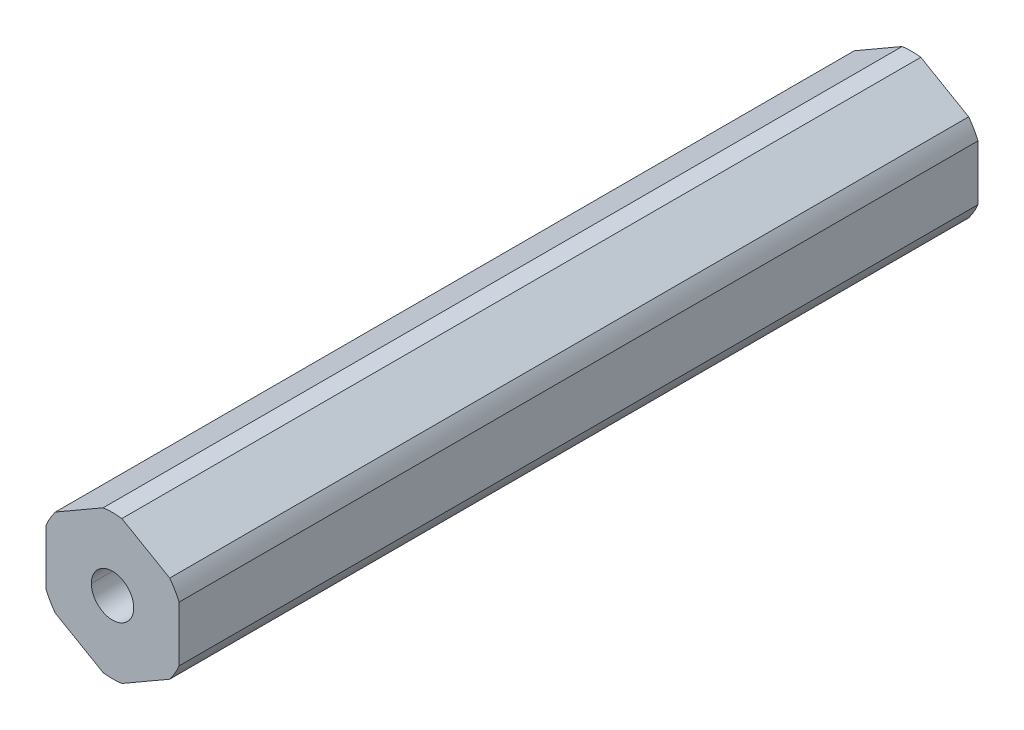
ISO-10303-21;
HEADER;
FILE_DESCRIPTION(('STEP AP214'),'2;1');
FILE_NAME('part.step','',(''),(''),'','','');
FILE_SCHEMA(('AUTOMOTIVE_DESIGN { 1 0 10303 214 1 1 1 1 }'));
ENDSEC;
DATA;
#1=APPLICATION_CONTEXT('core data for automotive mechanical design processes');
#2=APPLICATION_PROTOCOL_DEFINITION('international standard','automotive_design',2000,#1);
#3=PRODUCT_CONTEXT('',#1,'mechanical');
#4=PRODUCT('Part','Part','',(#3));
#5=PRODUCT_RELATED_PRODUCT_CATEGORY('part','',(#4));
#6=PRODUCT_DEFINITION_FORMATION('','',#4);
#7=PRODUCT_DEFINITION_CONTEXT('part definition',#1,'design');
#8=PRODUCT_DEFINITION('design','',#6,#7);
#9=PRODUCT_DEFINITION_SHAPE('','',#8);
#10=(LENGTH_UNIT() NAMED_UNIT(*) SI_UNIT(.MILLI.,.METRE.));
#11=(NAMED_UNIT(*) PLANE_ANGLE_UNIT() SI_UNIT($,.RADIAN.));
#12=(NAMED_UNIT(*) SI_UNIT($,.STERADIAN.) SOLID_ANGLE_UNIT());
#13=UNCERTAINTY_MEASURE_WITH_UNIT(LENGTH_MEASURE(1.E-05),#10,'distance_accuracy_value','');
#14=(GEOMETRIC_REPRESENTATION_CONTEXT(3) GLOBAL_UNCERTAINTY_ASSIGNED_CONTEXT((#13)) GLOBAL_UNIT_ASSIGNED_CONTEXT((#10,
#11,#12)) REPRESENTATION_CONTEXT('',''));
#15=CARTESIAN_POINT('',(0.,0.,0.));
#16=DIRECTION('',(0.,0.,1.));
#17=DIRECTION('',(1.,0.,0.));
#18=AXIS2_PLACEMENT_3D('',#15,#16,#17);
#19=CARTESIAN_POINT('',(0.,0.,-38.1));
#20=DIRECTION('',(0.,0.,1.));
#21=DIRECTION('',(1.,0.,0.));
#22=AXIS2_PLACEMENT_3D('',#19,#20,#21);
#23=PLANE('',#22);
#24=CARTESIAN_POINT('',(0.,0.,-38.1));
#25=DIRECTION('',(0.,0.,1.));
#26=DIRECTION('',(1.,0.,0.));
#27=AXIS2_PLACEMENT_3D('',#24,#25,#26);
#28=CIRCLE('',#27,2.0193);
#29=CARTESIAN_POINT('',(-2.0193,0.,-38.1));
#30=VERTEX_POINT('',#29);
#31=CARTESIAN_POINT('',(2.0193,0.,-38.1));
#32=VERTEX_POINT('',#31);
#33=EDGE_CURVE('E284',#30,#32,#28,.T.);
#34=ORIENTED_EDGE('',*,*,#33,.T.);
#35=CARTESIAN_POINT('',(0.,0.,-38.1));
#36=DIRECTION('',(0.,0.,1.));
#37=DIRECTION('',(1.,0.,0.));
#38=AXIS2_PLACEMENT_3D('',#35,#36,#37);
#39=CIRCLE('',#38,2.0193);
#40=EDGE_CURVE('E263',#32,#30,#39,.T.);
#41=ORIENTED_EDGE('',*,*,#40,.T.);
#42=EDGE_LOOP('',(#34,#41));
#43=FACE_BOUND('',#42,.T.);
#44=DIRECTION('',(0.,1.,0.));
#45=VECTOR('',#44,1.);
#46=CARTESIAN_POINT('',(6.345,0.,-38.1));
#47=LINE('',#46,#45);
#48=CARTESIAN_POINT('',(6.345,-2.63398462410091,-38.1));
#49=VERTEX_POINT('',#48);
#50=CARTESIAN_POINT('',(6.345,2.63398462410091,-38.1));
#51=VERTEX_POINT('',#50);
#52=EDGE_CURVE('E243',#49,#51,#47,.T.);
#53=ORIENTED_EDGE('',*,*,#52,.F.);
#54=CARTESIAN_POINT('',(0.,0.,-38.1));
#55=DIRECTION('',(0.,0.,1.));
#56=DIRECTION('',(1.,0.,0.));
#57=AXIS2_PLACEMENT_3D('',#54,#55,#56);
#58=CIRCLE('',#57,6.87);
#59=CARTESIAN_POINT('',(5.45359759764899,-4.17793887496182,-38.1));
#60=VERTEX_POINT('',#59);
#61=EDGE_CURVE('E25',#60,#49,#58,.T.);
#62=ORIENTED_EDGE('',*,*,#61,.F.);
#63=DIRECTION('',(0.866025403784439,0.5,0.));
#64=VECTOR('',#63,1.);
#65=CARTESIAN_POINT('',(3.1725,-5.49493118701227,-38.1));
#66=LINE('',#65,#64);
#67=CARTESIAN_POINT('',(0.891402402351011,-6.81192349906272,-38.1));
#68=VERTEX_POINT('',#67);
#69=EDGE_CURVE('E80',#68,#60,#66,.T.);
#70=ORIENTED_EDGE('',*,*,#69,.F.);
#71=CARTESIAN_POINT('',(0.,0.,-38.1));
#72=DIRECTION('',(0.,0.,1.));
#73=DIRECTION('',(1.,0.,0.));
#74=AXIS2_PLACEMENT_3D('',#71,#72,#73);
#75=CIRCLE('',#74,6.87);
#76=CARTESIAN_POINT('',(-0.891402402351014,-6.81192349906272,-38.1));
#77=VERTEX_POINT('',#76);
#78=EDGE_CURVE('E232',#77,#68,#75,.T.);
#79=ORIENTED_EDGE('',*,*,#78,.F.);
#80=DIRECTION('',(0.866025403784439,-0.5,0.));
#81=VECTOR('',#80,1.);
#82=CARTESIAN_POINT('',(-3.1725,-5.49493118701226,-38.1));
#83=LINE('',#82,#81);
#84=CARTESIAN_POINT('',(-5.45359759764899,-4.17793887496181,-38.1));
#85=VERTEX_POINT('',#84);
#86=EDGE_CURVE('E219',#85,#77,#83,.T.);
#87=ORIENTED_EDGE('',*,*,#86,.F.);
#88=CARTESIAN_POINT('',(0.,0.,-38.1));
#89=DIRECTION('',(0.,0.,1.));
#90=DIRECTION('',(1.,0.,0.));
#91=AXIS2_PLACEMENT_3D('',#88,#89,#90);
#92=CIRCLE('',#91,6.87);
#93=CARTESIAN_POINT('',(-6.345,-2.63398462410091,-38.1));
#94=VERTEX_POINT('',#93);
#95=EDGE_CURVE('E149',#94,#85,#92,.T.);
#96=ORIENTED_EDGE('',*,*,#95,.F.);
#97=DIRECTION('',(0.,-1.,0.));
#98=VECTOR('',#97,1.);
#99=CARTESIAN_POINT('',(-6.345,0.,-38.1));
#100=LINE('',#99,#98);
#101=CARTESIAN_POINT('',(-6.345,2.63398462410091,-38.1));
#102=VERTEX_POINT('',#101);
#103=EDGE_CURVE('E228',#102,#94,#100,.T.);
#104=ORIENTED_EDGE('',*,*,#103,.F.);
#105=CARTESIAN_POINT('',(0.,0.,-38.1));
#106=DIRECTION('',(0.,0.,1.));
#107=DIRECTION('',(1.,0.,0.));
#108=AXIS2_PLACEMENT_3D('',#105,#106,#107);
#109=CIRCLE('',#108,6.87);
#110=CARTESIAN_POINT('',(-5.45359759764899,4.17793887496182,-38.1));
#111=VERTEX_POINT('',#110);
#112=EDGE_CURVE('E182',#111,#102,#109,.T.);
#113=ORIENTED_EDGE('',*,*,#112,.F.);
#114=DIRECTION('',(-0.866025403784439,-0.5,0.));
#115=VECTOR('',#114,1.);
#116=CARTESIAN_POINT('',(-3.1725,5.49493118701227,-38.1));
#117=LINE('',#116,#115);
#118=CARTESIAN_POINT('',(-0.891402402351017,6.81192349906272,-38.1));
#119=VERTEX_POINT('',#118);
#120=EDGE_CURVE('E195',#119,#111,#117,.T.);
#121=ORIENTED_EDGE('',*,*,#120,.F.);
#122=CARTESIAN_POINT('',(0.,0.,-38.1));
#123=DIRECTION('',(0.,0.,1.));
#124=DIRECTION('',(1.,0.,0.));
#125=AXIS2_PLACEMENT_3D('',#122,#123,#124);
#126=CIRCLE('',#125,6.87);
#127=CARTESIAN_POINT('',(0.891402402351017,6.81192349906272,-38.1));
#128=VERTEX_POINT('',#127);
#129=EDGE_CURVE('E198',#128,#119,#126,.T.);
#130=ORIENTED_EDGE('',*,*,#129,.F.);
#131=DIRECTION('',(-0.866025403784439,0.5,0.));
#132=VECTOR('',#131,1.);
#133=CARTESIAN_POINT('',(3.1725,5.49493118701227,-38.1));
#134=LINE('',#133,#132);
#135=CARTESIAN_POINT('',(5.45359759764899,4.17793887496182,-38.1));
#136=VERTEX_POINT('',#135);
#137=EDGE_CURVE('E290',#136,#128,#134,.T.);
#138=ORIENTED_EDGE('',*,*,#137,.F.);
#139=CARTESIAN_POINT('',(0.,0.,-38.1));
#140=DIRECTION('',(0.,0.,1.));
#141=DIRECTION('',(1.,0.,0.));
#142=AXIS2_PLACEMENT_3D('',#139,#140,#141);
#143=CIRCLE('',#142,6.87);
#144=EDGE_CURVE('E253',#51,#136,#143,.T.);
#145=ORIENTED_EDGE('',*,*,#144,.F.);
#146=EDGE_LOOP('',(#53,#62,#70,#79,#87,#96,#104,#113,#121,#130,#138,#145));
#147=FACE_BOUND('',#146,.T.);
#148=ADVANCED_FACE('F15',(#43,#147),#23,.F.);
#149=CARTESIAN_POINT('',(0.,0.,38.1));
#150=DIRECTION('',(0.,0.,1.));
#151=DIRECTION('',(1.,0.,0.));
#152=AXIS2_PLACEMENT_3D('',#149,#150,#151);
#153=PLANE('',#152);
#154=CARTESIAN_POINT('',(0.,0.,38.1));
#155=DIRECTION('',(0.,0.,1.));
#156=DIRECTION('',(1.,0.,0.));
#157=AXIS2_PLACEMENT_3D('',#154,#155,#156);
#158=CIRCLE('',#157,2.0193);
#159=CARTESIAN_POINT('',(-2.0193,0.,38.1));
#160=VERTEX_POINT('',#159);
#161=CARTESIAN_POINT('',(2.0193,0.,38.1));
#162=VERTEX_POINT('',#161);
#163=EDGE_CURVE('E238',#160,#162,#158,.T.);
#164=ORIENTED_EDGE('',*,*,#163,.F.);
#165=CARTESIAN_POINT('',(0.,0.,38.1));
#166=DIRECTION('',(0.,0.,1.));
#167=DIRECTION('',(1.,0.,0.));
#168=AXIS2_PLACEMENT_3D('',#165,#166,#167);
#169=CIRCLE('',#168,2.0193);
#170=EDGE_CURVE('E266',#162,#160,#169,.T.);
#171=ORIENTED_EDGE('',*,*,#170,.F.);
#172=EDGE_LOOP('',(#164,#171));
#173=FACE_BOUND('',#172,.T.);
#174=DIRECTION('',(0.,1.,0.));
#175=VECTOR('',#174,1.);
#176=CARTESIAN_POINT('',(6.345,0.,38.1));
#177=LINE('',#176,#175);
#178=CARTESIAN_POINT('',(6.345,-2.63398462410091,38.1));
#179=VERTEX_POINT('',#178);
#180=CARTESIAN_POINT('',(6.345,2.63398462410091,38.1));
#181=VERTEX_POINT('',#180);
#182=EDGE_CURVE('E304',#179,#181,#177,.T.);
#183=ORIENTED_EDGE('',*,*,#182,.T.);
#184=CARTESIAN_POINT('',(0.,0.,38.1));
#185=DIRECTION('',(0.,0.,1.));
#186=DIRECTION('',(1.,0.,0.));
#187=AXIS2_PLACEMENT_3D('',#184,#185,#186);
#188=CIRCLE('',#187,6.87);
#189=CARTESIAN_POINT('',(5.45359759764899,4.17793887496182,38.1));
#190=VERTEX_POINT('',#189);
#191=EDGE_CURVE('E252',#181,#190,#188,.T.);
#192=ORIENTED_EDGE('',*,*,#191,.T.);
#193=DIRECTION('',(-0.866025403784439,0.5,0.));
#194=VECTOR('',#193,1.);
#195=CARTESIAN_POINT('',(3.1725,5.49493118701227,38.1));
#196=LINE('',#195,#194);
#197=CARTESIAN_POINT('',(0.891402402351017,6.81192349906272,38.1));
#198=VERTEX_POINT('',#197);
#199=EDGE_CURVE('E190',#190,#198,#196,.T.);
#200=ORIENTED_EDGE('',*,*,#199,.T.);
#201=CARTESIAN_POINT('',(0.,0.,38.1));
#202=DIRECTION('',(0.,0.,1.));
#203=DIRECTION('',(1.,0.,0.));
#204=AXIS2_PLACEMENT_3D('',#201,#202,#203);
#205=CIRCLE('',#204,6.87);
#206=CARTESIAN_POINT('',(-0.891402402351017,6.81192349906272,38.1));
#207=VERTEX_POINT('',#206);
#208=EDGE_CURVE('E186',#198,#207,#205,.T.);
#209=ORIENTED_EDGE('',*,*,#208,.T.);
#210=DIRECTION('',(-0.866025403784439,-0.5,0.));
#211=VECTOR('',#210,1.);
#212=CARTESIAN_POINT('',(-3.1725,5.49493118701227,38.1));
#213=LINE('',#212,#211);
#214=CARTESIAN_POINT('',(-5.45359759764899,4.17793887496182,38.1));
#215=VERTEX_POINT('',#214);
#216=EDGE_CURVE('E172',#207,#215,#213,.T.);
#217=ORIENTED_EDGE('',*,*,#216,.T.);
#218=CARTESIAN_POINT('',(0.,0.,38.1));
#219=DIRECTION('',(0.,0.,1.));
#220=DIRECTION('',(1.,0.,0.));
#221=AXIS2_PLACEMENT_3D('',#218,#219,#220);
#222=CIRCLE('',#221,6.87);
#223=CARTESIAN_POINT('',(-6.345,2.63398462410091,38.1));
#224=VERTEX_POINT('',#223);
#225=EDGE_CURVE('E224',#215,#224,#222,.T.);
#226=ORIENTED_EDGE('',*,*,#225,.T.);
#227=DIRECTION('',(0.,-1.,0.));
#228=VECTOR('',#227,1.);
#229=CARTESIAN_POINT('',(-6.345,0.,38.1));
#230=LINE('',#229,#228);
#231=CARTESIAN_POINT('',(-6.345,-2.63398462410091,38.1));
#232=VERTEX_POINT('',#231);
#233=EDGE_CURVE('E139',#224,#232,#230,.T.);
#234=ORIENTED_EDGE('',*,*,#233,.T.);
#235=CARTESIAN_POINT('',(0.,0.,38.1));
#236=DIRECTION('',(0.,0.,1.));
#237=DIRECTION('',(1.,0.,0.));
#238=AXIS2_PLACEMENT_3D('',#235,#236,#237);
#239=CIRCLE('',#238,6.87);
#240=CARTESIAN_POINT('',(-5.45359759764899,-4.17793887496181,38.1));
#241=VERTEX_POINT('',#240);
#242=EDGE_CURVE('E215',#232,#241,#239,.T.);
#243=ORIENTED_EDGE('',*,*,#242,.T.);
#244=DIRECTION('',(0.866025403784439,-0.5,0.));
#245=VECTOR('',#244,1.);
#246=CARTESIAN_POINT('',(-3.1725,-5.49493118701226,38.1));
#247=LINE('',#246,#245);
#248=CARTESIAN_POINT('',(-0.891402402351014,-6.81192349906272,38.1));
#249=VERTEX_POINT('',#248);
#250=EDGE_CURVE('E237',#241,#249,#247,.T.);
#251=ORIENTED_EDGE('',*,*,#250,.T.);
#252=CARTESIAN_POINT('',(0.,0.,38.1));
#253=DIRECTION('',(0.,0.,1.));
#254=DIRECTION('',(1.,0.,0.));
#255=AXIS2_PLACEMENT_3D('',#252,#253,#254);
#256=CIRCLE('',#255,6.87);
#257=CARTESIAN_POINT('',(0.891402402351011,-6.81192349906272,38.1));
#258=VERTEX_POINT('',#257);
#259=EDGE_CURVE('E94',#249,#258,#256,.T.);
#260=ORIENTED_EDGE('',*,*,#259,.T.);
#261=DIRECTION('',(0.866025403784439,0.5,0.));
#262=VECTOR('',#261,1.);
#263=CARTESIAN_POINT('',(3.1725,-5.49493118701227,38.1));
#264=LINE('',#263,#262);
#265=CARTESIAN_POINT('',(5.45359759764899,-4.17793887496182,38.1));
#266=VERTEX_POINT('',#265);
#267=EDGE_CURVE('E274',#258,#266,#264,.T.);
#268=ORIENTED_EDGE('',*,*,#267,.T.);
#269=CARTESIAN_POINT('',(0.,0.,38.1));
#270=DIRECTION('',(0.,0.,1.));
#271=DIRECTION('',(1.,0.,0.));
#272=AXIS2_PLACEMENT_3D('',#269,#270,#271);
#273=CIRCLE('',#272,6.87);
#274=EDGE_CURVE('E10',#266,#179,#273,.T.);
#275=ORIENTED_EDGE('',*,*,#274,.T.);
#276=EDGE_LOOP('',(#183,#192,#200,#209,#217,#226,#234,#243,#251,#260,#268,#275));
#277=FACE_BOUND('',#276,.T.);
#278=ADVANCED_FACE('F188',(#173,#277),#153,.T.);
#279=CARTESIAN_POINT('',(0.,0.,38.1));
#280=DIRECTION('',(0.,0.,-1.));
#281=DIRECTION('',(-1.,0.,0.));
#282=AXIS2_PLACEMENT_3D('',#279,#280,#281);
#283=CYLINDRICAL_SURFACE('',#282,6.87);
#284=ORIENTED_EDGE('',*,*,#61,.T.);
#285=DIRECTION('',(0.,0.,-1.));
#286=VECTOR('',#285,1.);
#287=CARTESIAN_POINT('',(6.345,-2.63398462410091,38.1));
#288=LINE('',#287,#286);
#289=EDGE_CURVE('E283',#179,#49,#288,.T.);
#290=ORIENTED_EDGE('',*,*,#289,.F.);
#291=ORIENTED_EDGE('',*,*,#274,.F.);
#292=DIRECTION('',(0.,0.,-1.));
#293=VECTOR('',#292,1.);
#294=CARTESIAN_POINT('',(5.45359759764899,-4.17793887496182,38.1));
#295=LINE('',#294,#293);
#296=EDGE_CURVE('E259',#266,#60,#295,.T.);
#297=ORIENTED_EDGE('',*,*,#296,.T.);
#298=EDGE_LOOP('',(#284,#290,#291,#297));
#299=FACE_BOUND('',#298,.T.);
#300=ADVANCED_FACE('F329',(#299),#283,.T.);
#301=CARTESIAN_POINT('',(0.,0.,38.1));
#302=DIRECTION('',(0.,0.,-1.));
#303=DIRECTION('',(-1.,0.,0.));
#304=AXIS2_PLACEMENT_3D('',#301,#302,#303);
#305=CYLINDRICAL_SURFACE('',#304,2.0193);
#306=DIRECTION('',(0.,0.,-1.));
#307=VECTOR('',#306,1.);
#308=CARTESIAN_POINT('',(2.0193,0.,38.1));
#309=LINE('',#308,#307);
#310=EDGE_CURVE('E242',#162,#32,#309,.T.);
#311=ORIENTED_EDGE('',*,*,#310,.F.);
#312=ORIENTED_EDGE('',*,*,#170,.T.);
#313=DIRECTION('',(0.,0.,-1.));
#314=VECTOR('',#313,1.);
#315=CARTESIAN_POINT('',(-2.0193,0.,38.1));
#316=LINE('',#315,#314);
#317=EDGE_CURVE('E248',#160,#30,#316,.T.);
#318=ORIENTED_EDGE('',*,*,#317,.T.);
#319=ORIENTED_EDGE('',*,*,#40,.F.);
#320=EDGE_LOOP('',(#311,#312,#318,#319));
#321=FACE_BOUND('',#320,.T.);
#322=ADVANCED_FACE('F316',(#321),#305,.F.);
#323=CARTESIAN_POINT('',(3.1725,-5.49493118701227,38.1));
#324=DIRECTION('',(-0.5,0.866025403784439,0.));
#325=DIRECTION('',(0.,0.,1.));
#326=AXIS2_PLACEMENT_3D('',#323,#324,#325);
#327=PLANE('',#326);
#328=ORIENTED_EDGE('',*,*,#69,.T.);
#329=ORIENTED_EDGE('',*,*,#296,.F.);
#330=ORIENTED_EDGE('',*,*,#267,.F.);
#331=DIRECTION('',(0.,0.,-1.));
#332=VECTOR('',#331,1.);
#333=CARTESIAN_POINT('',(0.891402402351011,-6.81192349906272,38.1));
#334=LINE('',#333,#332);
#335=EDGE_CURVE('E236',#258,#68,#334,.T.);
#336=ORIENTED_EDGE('',*,*,#335,.T.);
#337=EDGE_LOOP('',(#328,#329,#330,#336));
#338=FACE_BOUND('',#337,.T.);
#339=ADVANCED_FACE('F332',(#338),#327,.F.);
#340=CARTESIAN_POINT('',(0.,0.,38.1));
#341=DIRECTION('',(0.,0.,-1.));
#342=DIRECTION('',(-1.,0.,0.));
#343=AXIS2_PLACEMENT_3D('',#340,#341,#342);
#344=CYLINDRICAL_SURFACE('',#343,6.87);
#345=ORIENTED_EDGE('',*,*,#78,.T.);
#346=ORIENTED_EDGE('',*,*,#335,.F.);
#347=ORIENTED_EDGE('',*,*,#259,.F.);
#348=DIRECTION('',(0.,0.,-1.));
#349=VECTOR('',#348,1.);
#350=CARTESIAN_POINT('',(-0.891402402351014,-6.81192349906272,38.1));
#351=LINE('',#350,#349);
#352=EDGE_CURVE('E296',#249,#77,#351,.T.);
#353=ORIENTED_EDGE('',*,*,#352,.T.);
#354=EDGE_LOOP('',(#345,#346,#347,#353));
#355=FACE_BOUND('',#354,.T.);
#356=ADVANCED_FACE('F333',(#355),#344,.T.);
#357=CARTESIAN_POINT('',(-3.1725,-5.49493118701226,38.1));
#358=DIRECTION('',(0.5,0.866025403784439,0.));
#359=DIRECTION('',(0.,0.,-1.));
#360=AXIS2_PLACEMENT_3D('',#357,#358,#359);
#361=PLANE('',#360);
#362=ORIENTED_EDGE('',*,*,#86,.T.);
#363=ORIENTED_EDGE('',*,*,#352,.F.);
#364=ORIENTED_EDGE('',*,*,#250,.F.);
#365=DIRECTION('',(0.,0.,-1.));
#366=VECTOR('',#365,1.);
#367=CARTESIAN_POINT('',(-5.45359759764899,-4.17793887496181,38.1));
#368=LINE('',#367,#366);
#369=EDGE_CURVE('E220',#241,#85,#368,.T.);
#370=ORIENTED_EDGE('',*,*,#369,.T.);
#371=EDGE_LOOP('',(#362,#363,#364,#370));
#372=FACE_BOUND('',#371,.T.);
#373=ADVANCED_FACE('F338',(#372),#361,.F.);
#374=CARTESIAN_POINT('',(0.,0.,38.1));
#375=DIRECTION('',(0.,0.,-1.));
#376=DIRECTION('',(-1.,0.,0.));
#377=AXIS2_PLACEMENT_3D('',#374,#375,#376);
#378=CYLINDRICAL_SURFACE('',#377,6.87);
#379=ORIENTED_EDGE('',*,*,#95,.T.);
#380=ORIENTED_EDGE('',*,*,#369,.F.);
#381=ORIENTED_EDGE('',*,*,#242,.F.);
#382=DIRECTION('',(0.,0.,-1.));
#383=VECTOR('',#382,1.);
#384=CARTESIAN_POINT('',(-6.345,-2.63398462410091,38.1));
#385=LINE('',#384,#383);
#386=EDGE_CURVE('E227',#232,#94,#385,.T.);
#387=ORIENTED_EDGE('',*,*,#386,.T.);
#388=EDGE_LOOP('',(#379,#380,#381,#387));
#389=FACE_BOUND('',#388,.T.);
#390=ADVANCED_FACE('F340',(#389),#378,.T.);
#391=CARTESIAN_POINT('',(-6.345,0.,38.1));
#392=DIRECTION('',(1.,0.,0.));
#393=DIRECTION('',(0.,1.,0.));
#394=AXIS2_PLACEMENT_3D('',#391,#392,#393);
#395=PLANE('',#394);
#396=ORIENTED_EDGE('',*,*,#103,.T.);
#397=ORIENTED_EDGE('',*,*,#386,.F.);
#398=ORIENTED_EDGE('',*,*,#233,.F.);
#399=DIRECTION('',(0.,0.,-1.));
#400=VECTOR('',#399,1.);
#401=CARTESIAN_POINT('',(-6.345,2.63398462410091,38.1));
#402=LINE('',#401,#400);
#403=EDGE_CURVE('E221',#224,#102,#402,.T.);
#404=ORIENTED_EDGE('',*,*,#403,.T.);
#405=EDGE_LOOP('',(#396,#397,#398,#404));
#406=FACE_BOUND('',#405,.T.);
#407=ADVANCED_FACE('F469',(#406),#395,.F.);
#408=CARTESIAN_POINT('',(0.,0.,38.1));
#409=DIRECTION('',(0.,0.,-1.));
#410=DIRECTION('',(-1.,0.,0.));
#411=AXIS2_PLACEMENT_3D('',#408,#409,#410);
#412=CYLINDRICAL_SURFACE('',#411,6.87);
#413=ORIENTED_EDGE('',*,*,#112,.T.);
#414=ORIENTED_EDGE('',*,*,#403,.F.);
#415=ORIENTED_EDGE('',*,*,#225,.F.);
#416=DIRECTION('',(0.,0.,-1.));
#417=VECTOR('',#416,1.);
#418=CARTESIAN_POINT('',(-5.45359759764899,4.17793887496182,38.1));
#419=LINE('',#418,#417);
#420=EDGE_CURVE('E179',#215,#111,#419,.T.);
#421=ORIENTED_EDGE('',*,*,#420,.T.);
#422=EDGE_LOOP('',(#413,#414,#415,#421));
#423=FACE_BOUND('',#422,.T.);
#424=ADVANCED_FACE('F465',(#423),#412,.T.);
#425=CARTESIAN_POINT('',(-3.1725,5.49493118701227,38.1));
#426=DIRECTION('',(0.5,-0.866025403784439,0.));
#427=DIRECTION('',(0.,0.,-1.));
#428=AXIS2_PLACEMENT_3D('',#425,#426,#427);
#429=PLANE('',#428);
#430=ORIENTED_EDGE('',*,*,#120,.T.);
#431=ORIENTED_EDGE('',*,*,#420,.F.);
#432=ORIENTED_EDGE('',*,*,#216,.F.);
#433=DIRECTION('',(0.,0.,-1.));
#434=VECTOR('',#433,1.);
#435=CARTESIAN_POINT('',(-0.891402402351017,6.81192349906272,38.1));
#436=LINE('',#435,#434);
#437=EDGE_CURVE('E18',#207,#119,#436,.T.);
#438=ORIENTED_EDGE('',*,*,#437,.T.);
#439=EDGE_LOOP('',(#430,#431,#432,#438));
#440=FACE_BOUND('',#439,.T.);
#441=ADVANCED_FACE('F175',(#440),#429,.F.);
#442=CARTESIAN_POINT('',(0.,0.,38.1));
#443=DIRECTION('',(0.,0.,-1.));
#444=DIRECTION('',(-1.,0.,0.));
#445=AXIS2_PLACEMENT_3D('',#442,#443,#444);
#446=CYLINDRICAL_SURFACE('',#445,6.87);
#447=ORIENTED_EDGE('',*,*,#129,.T.);
#448=ORIENTED_EDGE('',*,*,#437,.F.);
#449=ORIENTED_EDGE('',*,*,#208,.F.);
#450=DIRECTION('',(0.,0.,-1.));
#451=VECTOR('',#450,1.);
#452=CARTESIAN_POINT('',(0.891402402351017,6.81192349906272,38.1));
#453=LINE('',#452,#451);
#454=EDGE_CURVE('E210',#198,#128,#453,.T.);
#455=ORIENTED_EDGE('',*,*,#454,.T.);
#456=EDGE_LOOP('',(#447,#448,#449,#455));
#457=FACE_BOUND('',#456,.T.);
#458=ADVANCED_FACE('F197',(#457),#446,.T.);
#459=CARTESIAN_POINT('',(3.1725,5.49493118701227,38.1));
#460=DIRECTION('',(-0.5,-0.866025403784439,0.));
#461=DIRECTION('',(-0.866025403784439,0.5,0.));
#462=AXIS2_PLACEMENT_3D('',#459,#460,#461);
#463=PLANE('',#462);
#464=ORIENTED_EDGE('',*,*,#137,.T.);
#465=ORIENTED_EDGE('',*,*,#454,.F.);
#466=ORIENTED_EDGE('',*,*,#199,.F.);
#467=DIRECTION('',(0.,0.,-1.));
#468=VECTOR('',#467,1.);
#469=CARTESIAN_POINT('',(5.45359759764899,4.17793887496182,38.1));
#470=LINE('',#469,#468);
#471=EDGE_CURVE('E249',#190,#136,#470,.T.);
#472=ORIENTED_EDGE('',*,*,#471,.T.);
#473=EDGE_LOOP('',(#464,#465,#466,#472));
#474=FACE_BOUND('',#473,.T.);
#475=ADVANCED_FACE('F519',(#474),#463,.F.);
#476=CARTESIAN_POINT('',(0.,0.,38.1));
#477=DIRECTION('',(0.,0.,-1.));
#478=DIRECTION('',(-1.,0.,0.));
#479=AXIS2_PLACEMENT_3D('',#476,#477,#478);
#480=CYLINDRICAL_SURFACE('',#479,6.87);
#481=ORIENTED_EDGE('',*,*,#144,.T.);
#482=ORIENTED_EDGE('',*,*,#471,.F.);
#483=ORIENTED_EDGE('',*,*,#191,.F.);
#484=DIRECTION('',(0.,0.,-1.));
#485=VECTOR('',#484,1.);
#486=CARTESIAN_POINT('',(6.345,2.63398462410091,38.1));
#487=LINE('',#486,#485);
#488=EDGE_CURVE('E247',#181,#51,#487,.T.);
#489=ORIENTED_EDGE('',*,*,#488,.T.);
#490=EDGE_LOOP('',(#481,#482,#483,#489));
#491=FACE_BOUND('',#490,.T.);
#492=ADVANCED_FACE('F524',(#491),#480,.T.);
#493=CARTESIAN_POINT('',(6.345,0.,38.1));
#494=DIRECTION('',(-1.,0.,0.));
#495=DIRECTION('',(0.,1.,0.));
#496=AXIS2_PLACEMENT_3D('',#493,#494,#495);
#497=PLANE('',#496);
#498=ORIENTED_EDGE('',*,*,#52,.T.);
#499=ORIENTED_EDGE('',*,*,#488,.F.);
#500=ORIENTED_EDGE('',*,*,#182,.F.);
#501=ORIENTED_EDGE('',*,*,#289,.T.);
#502=EDGE_LOOP('',(#498,#499,#500,#501));
#503=FACE_BOUND('',#502,.T.);
#504=ADVANCED_FACE('F327',(#503),#497,.F.);
#505=CARTESIAN_POINT('',(0.,0.,38.1));
#506=DIRECTION('',(0.,0.,-1.));
#507=DIRECTION('',(-1.,0.,0.));
#508=AXIS2_PLACEMENT_3D('',#505,#506,#507);
#509=CYLINDRICAL_SURFACE('',#508,2.0193);
#510=ORIENTED_EDGE('',*,*,#163,.T.);
#511=ORIENTED_EDGE('',*,*,#310,.T.);
#512=ORIENTED_EDGE('',*,*,#33,.F.);
#513=ORIENTED_EDGE('',*,*,#317,.F.);
#514=EDGE_LOOP('',(#510,#511,#512,#513));
#515=FACE_BOUND('',#514,.T.);
#516=ADVANCED_FACE('F320',(#515),#509,.F.);
#517=CLOSED_SHELL('',(#148,#278,#300,#322,#339,#356,#373,#390,#407,#424,#441,#458,#475,#492,
#504,#516));
#518=MANIFOLD_SOLID_BREP('B1',#517);
#519=ADVANCED_BREP_SHAPE_REPRESENTATION('',(#18,#518),#14);
#520=SHAPE_DEFINITION_REPRESENTATION(#9,#519);
ENDSEC;
END-ISO-10303-21;
